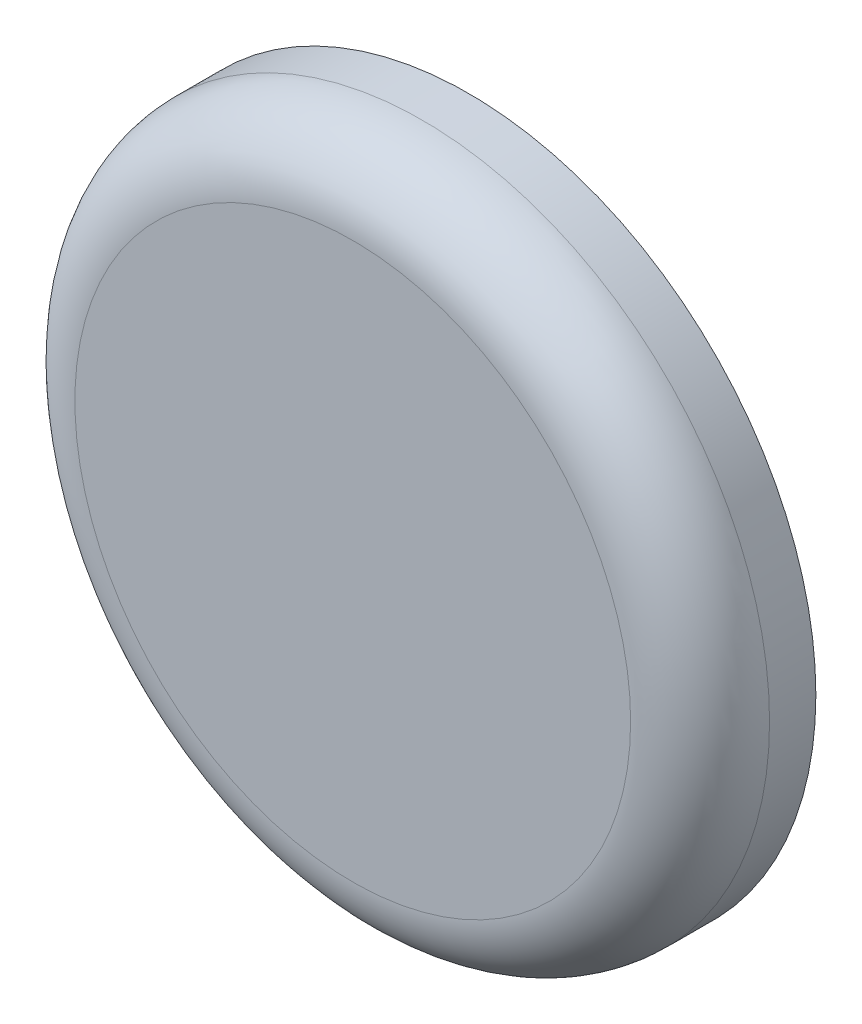
ISO-10303-21;
HEADER;
FILE_DESCRIPTION(('STEP AP214'),'2;1');
FILE_NAME('part.step','',(''),(''),'','','');
FILE_SCHEMA(('AUTOMOTIVE_DESIGN { 1 0 10303 214 1 1 1 1 }'));
ENDSEC;
DATA;
#1=APPLICATION_CONTEXT('core data for automotive mechanical design processes');
#2=APPLICATION_PROTOCOL_DEFINITION('international standard','automotive_design',2000,#1);
#3=PRODUCT_CONTEXT('',#1,'mechanical');
#4=PRODUCT('Part','Part','',(#3));
#5=PRODUCT_RELATED_PRODUCT_CATEGORY('part','',(#4));
#6=PRODUCT_DEFINITION_FORMATION('','',#4);
#7=PRODUCT_DEFINITION_CONTEXT('part definition',#1,'design');
#8=PRODUCT_DEFINITION('design','',#6,#7);
#9=PRODUCT_DEFINITION_SHAPE('','',#8);
#10=(LENGTH_UNIT() NAMED_UNIT(*) SI_UNIT(.MILLI.,.METRE.));
#11=(NAMED_UNIT(*) PLANE_ANGLE_UNIT() SI_UNIT($,.RADIAN.));
#12=(NAMED_UNIT(*) SI_UNIT($,.STERADIAN.) SOLID_ANGLE_UNIT());
#13=UNCERTAINTY_MEASURE_WITH_UNIT(LENGTH_MEASURE(1.E-05),#10,'distance_accuracy_value','');
#14=(GEOMETRIC_REPRESENTATION_CONTEXT(3) GLOBAL_UNCERTAINTY_ASSIGNED_CONTEXT((#13)) GLOBAL_UNIT_ASSIGNED_CONTEXT((#10,
#11,#12)) REPRESENTATION_CONTEXT('',''));
#15=CARTESIAN_POINT('',(0.,0.,0.));
#16=DIRECTION('',(0.,0.,1.));
#17=DIRECTION('',(1.,0.,0.));
#18=AXIS2_PLACEMENT_3D('',#15,#16,#17);
#19=CARTESIAN_POINT('',(0.,0.,5.));
#20=DIRECTION('',(0.,0.,-1.));
#21=DIRECTION('',(-1.,0.,0.));
#22=AXIS2_PLACEMENT_3D('',#19,#20,#21);
#23=CYLINDRICAL_SURFACE('',#22,15.);
#24=CARTESIAN_POINT('',(0.,0.,2.));
#25=DIRECTION('',(0.,0.,1.));
#26=DIRECTION('',(1.,0.,0.));
#27=AXIS2_PLACEMENT_3D('',#24,#25,#26);
#28=CIRCLE('',#27,15.);
#29=CARTESIAN_POINT('',(15.,0.,2.));
#30=VERTEX_POINT('',#29);
#31=EDGE_CURVE('E10',#30,#30,#28,.F.);
#32=ORIENTED_EDGE('',*,*,#31,.T.);
#33=EDGE_LOOP('',(#32));
#34=FACE_BOUND('',#33,.T.);
#35=CARTESIAN_POINT('',(0.,0.,0.));
#36=DIRECTION('',(0.,0.,1.));
#37=DIRECTION('',(1.,0.,0.));
#38=AXIS2_PLACEMENT_3D('',#35,#36,#37);
#39=CIRCLE('',#38,15.);
#40=CARTESIAN_POINT('',(15.,0.,0.));
#41=VERTEX_POINT('',#40);
#42=EDGE_CURVE('E48',#41,#41,#39,.T.);
#43=ORIENTED_EDGE('',*,*,#42,.T.);
#44=EDGE_LOOP('',(#43));
#45=FACE_BOUND('',#44,.T.);
#46=ADVANCED_FACE('F37',(#34,#45),#23,.T.);
#47=CARTESIAN_POINT('',(0.,0.,5.));
#48=DIRECTION('',(0.,0.,1.));
#49=DIRECTION('',(1.,0.,0.));
#50=AXIS2_PLACEMENT_3D('',#47,#48,#49);
#51=PLANE('',#50);
#52=CARTESIAN_POINT('',(0.,0.,5.));
#53=DIRECTION('',(0.,0.,1.));
#54=DIRECTION('',(1.,0.,0.));
#55=AXIS2_PLACEMENT_3D('',#52,#53,#54);
#56=CIRCLE('',#55,12.);
#57=CARTESIAN_POINT('',(12.,0.,5.));
#58=VERTEX_POINT('',#57);
#59=EDGE_CURVE('E44',#58,#58,#56,.T.);
#60=ORIENTED_EDGE('',*,*,#59,.T.);
#61=EDGE_LOOP('',(#60));
#62=FACE_BOUND('',#61,.T.);
#63=ADVANCED_FACE('F58',(#62),#51,.T.);
#64=CARTESIAN_POINT('',(0.,0.,0.));
#65=DIRECTION('',(0.,0.,1.));
#66=DIRECTION('',(1.,0.,0.));
#67=AXIS2_PLACEMENT_3D('',#64,#65,#66);
#68=PLANE('',#67);
#69=ORIENTED_EDGE('',*,*,#42,.F.);
#70=EDGE_LOOP('',(#69));
#71=FACE_BOUND('',#70,.T.);
#72=ADVANCED_FACE('F56',(#71),#68,.F.);
#73=CARTESIAN_POINT('',(0.,0.,2.));
#74=DIRECTION('',(0.,0.,1.));
#75=DIRECTION('',(1.,0.,0.));
#76=AXIS2_PLACEMENT_3D('',#73,#74,#75);
#77=TOROIDAL_SURFACE('',#76,12.,3.);
#78=ORIENTED_EDGE('',*,*,#31,.F.);
#79=EDGE_LOOP('',(#78));
#80=FACE_BOUND('',#79,.T.);
#81=ORIENTED_EDGE('',*,*,#59,.F.);
#82=EDGE_LOOP('',(#81));
#83=FACE_BOUND('',#82,.T.);
#84=ADVANCED_FACE('F39',(#80,#83),#77,.T.);
#85=CLOSED_SHELL('',(#46,#63,#72,#84));
#86=MANIFOLD_SOLID_BREP('B2',#85);
#87=ADVANCED_BREP_SHAPE_REPRESENTATION('',(#18,#86),#14);
#88=SHAPE_DEFINITION_REPRESENTATION(#9,#87);
ENDSEC;
END-ISO-10303-21;
